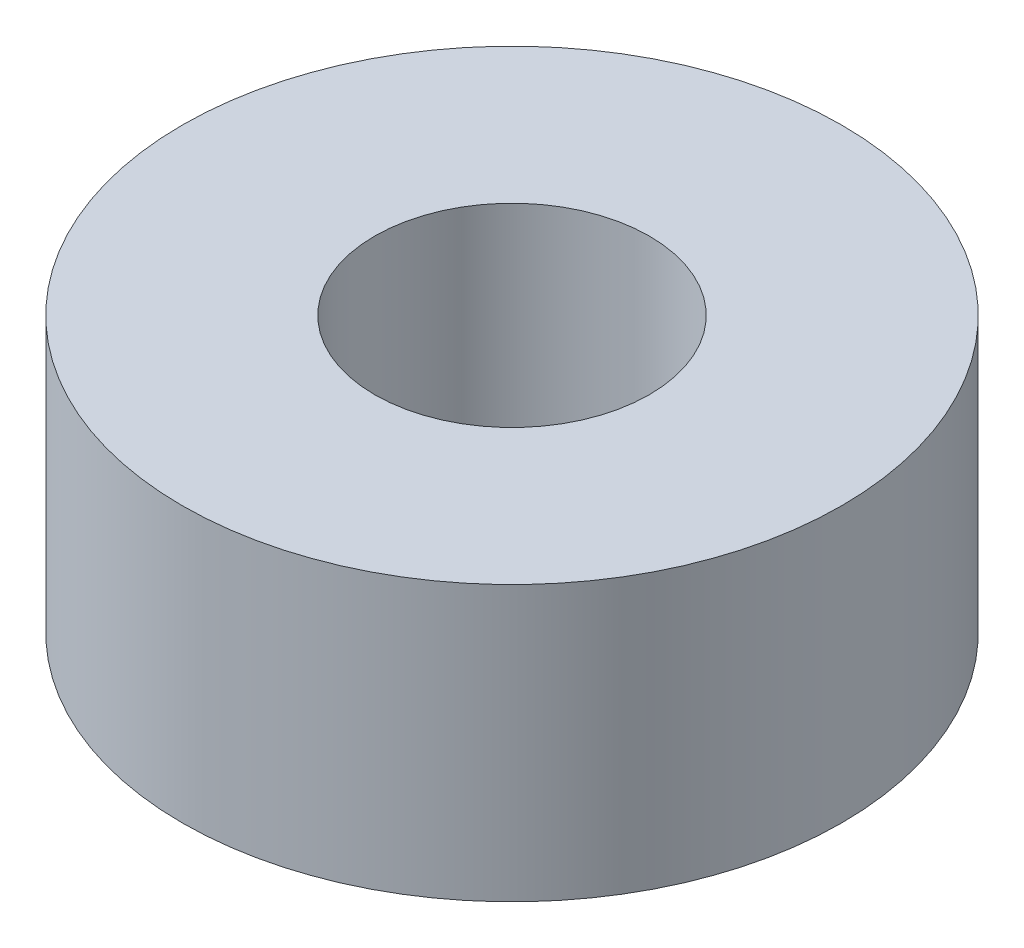
ISO-10303-21;
HEADER;
FILE_DESCRIPTION(('STEP AP214'),'2;1');
FILE_NAME('part.step','',(''),(''),'','','');
FILE_SCHEMA(('AUTOMOTIVE_DESIGN { 1 0 10303 214 1 1 1 1 }'));
ENDSEC;
DATA;
#1=APPLICATION_CONTEXT('core data for automotive mechanical design processes');
#2=APPLICATION_PROTOCOL_DEFINITION('international standard','automotive_design',2000,#1);
#3=PRODUCT_CONTEXT('',#1,'mechanical');
#4=PRODUCT('Part','Part','',(#3));
#5=PRODUCT_RELATED_PRODUCT_CATEGORY('part','',(#4));
#6=PRODUCT_DEFINITION_FORMATION('','',#4);
#7=PRODUCT_DEFINITION_CONTEXT('part definition',#1,'design');
#8=PRODUCT_DEFINITION('design','',#6,#7);
#9=PRODUCT_DEFINITION_SHAPE('','',#8);
#10=(LENGTH_UNIT() NAMED_UNIT(*) SI_UNIT(.MILLI.,.METRE.));
#11=(NAMED_UNIT(*) PLANE_ANGLE_UNIT() SI_UNIT($,.RADIAN.));
#12=(NAMED_UNIT(*) SI_UNIT($,.STERADIAN.) SOLID_ANGLE_UNIT());
#13=UNCERTAINTY_MEASURE_WITH_UNIT(LENGTH_MEASURE(1.E-05),#10,'distance_accuracy_value','');
#14=(GEOMETRIC_REPRESENTATION_CONTEXT(3) GLOBAL_UNCERTAINTY_ASSIGNED_CONTEXT((#13)) GLOBAL_UNIT_ASSIGNED_CONTEXT((#10,
#11,#12)) REPRESENTATION_CONTEXT('',''));
#15=CARTESIAN_POINT('',(0.,0.,0.));
#16=DIRECTION('',(0.,0.,1.));
#17=DIRECTION('',(1.,0.,0.));
#18=AXIS2_PLACEMENT_3D('',#15,#16,#17);
#19=CARTESIAN_POINT('',(0.,5.,0.));
#20=DIRECTION('',(0.,1.,0.));
#21=DIRECTION('',(0.,0.,1.));
#22=AXIS2_PLACEMENT_3D('',#19,#20,#21);
#23=PLANE('',#22);
#24=CARTESIAN_POINT('',(0.,5.,0.));
#25=DIRECTION('',(0.,1.,0.));
#26=DIRECTION('',(0.,0.,1.));
#27=AXIS2_PLACEMENT_3D('',#24,#25,#26);
#28=CIRCLE('',#27,6.);
#29=CARTESIAN_POINT('',(0.,5.,6.));
#30=VERTEX_POINT('',#29);
#31=EDGE_CURVE('E10',#30,#30,#28,.T.);
#32=ORIENTED_EDGE('',*,*,#31,.T.);
#33=EDGE_LOOP('',(#32));
#34=FACE_BOUND('',#33,.T.);
#35=CARTESIAN_POINT('',(0.,5.,0.));
#36=DIRECTION('',(0.,1.,0.));
#37=DIRECTION('',(0.,0.,1.));
#38=AXIS2_PLACEMENT_3D('',#35,#36,#37);
#39=CIRCLE('',#38,2.5);
#40=CARTESIAN_POINT('',(0.,5.,2.5));
#41=VERTEX_POINT('',#40);
#42=EDGE_CURVE('E42',#41,#41,#39,.T.);
#43=ORIENTED_EDGE('',*,*,#42,.F.);
#44=EDGE_LOOP('',(#43));
#45=FACE_BOUND('',#44,.T.);
#46=ADVANCED_FACE('F31',(#34,#45),#23,.T.);
#47=CARTESIAN_POINT('',(0.,0.,0.));
#48=DIRECTION('',(0.,1.,0.));
#49=DIRECTION('',(0.,0.,1.));
#50=AXIS2_PLACEMENT_3D('',#47,#48,#49);
#51=PLANE('',#50);
#52=CARTESIAN_POINT('',(0.,0.,0.));
#53=DIRECTION('',(0.,1.,0.));
#54=DIRECTION('',(0.,0.,1.));
#55=AXIS2_PLACEMENT_3D('',#52,#53,#54);
#56=CIRCLE('',#55,6.);
#57=CARTESIAN_POINT('',(0.,0.,6.));
#58=VERTEX_POINT('',#57);
#59=EDGE_CURVE('E35',#58,#58,#56,.T.);
#60=ORIENTED_EDGE('',*,*,#59,.F.);
#61=EDGE_LOOP('',(#60));
#62=FACE_BOUND('',#61,.T.);
#63=CARTESIAN_POINT('',(0.,0.,0.));
#64=DIRECTION('',(0.,1.,0.));
#65=DIRECTION('',(0.,0.,1.));
#66=AXIS2_PLACEMENT_3D('',#63,#64,#65);
#67=CIRCLE('',#66,2.5);
#68=CARTESIAN_POINT('',(0.,0.,2.5));
#69=VERTEX_POINT('',#68);
#70=EDGE_CURVE('E44',#69,#69,#67,.T.);
#71=ORIENTED_EDGE('',*,*,#70,.T.);
#72=EDGE_LOOP('',(#71));
#73=FACE_BOUND('',#72,.T.);
#74=ADVANCED_FACE('F54',(#62,#73),#51,.F.);
#75=CARTESIAN_POINT('',(0.,5.,0.));
#76=DIRECTION('',(0.,-1.,0.));
#77=DIRECTION('',(0.,0.,-1.));
#78=AXIS2_PLACEMENT_3D('',#75,#76,#77);
#79=CYLINDRICAL_SURFACE('',#78,6.);
#80=ORIENTED_EDGE('',*,*,#31,.F.);
#81=EDGE_LOOP('',(#80));
#82=FACE_BOUND('',#81,.T.);
#83=ORIENTED_EDGE('',*,*,#59,.T.);
#84=EDGE_LOOP('',(#83));
#85=FACE_BOUND('',#84,.T.);
#86=ADVANCED_FACE('F33',(#82,#85),#79,.T.);
#87=CARTESIAN_POINT('',(0.,5.,0.));
#88=DIRECTION('',(0.,-1.,0.));
#89=DIRECTION('',(0.,0.,-1.));
#90=AXIS2_PLACEMENT_3D('',#87,#88,#89);
#91=CYLINDRICAL_SURFACE('',#90,2.5);
#92=ORIENTED_EDGE('',*,*,#42,.T.);
#93=EDGE_LOOP('',(#92));
#94=FACE_BOUND('',#93,.T.);
#95=ORIENTED_EDGE('',*,*,#70,.F.);
#96=EDGE_LOOP('',(#95));
#97=FACE_BOUND('',#96,.T.);
#98=ADVANCED_FACE('F50',(#94,#97),#91,.F.);
#99=CLOSED_SHELL('',(#46,#74,#86,#98));
#100=MANIFOLD_SOLID_BREP('B2',#99);
#101=ADVANCED_BREP_SHAPE_REPRESENTATION('',(#18,#100),#14);
#102=SHAPE_DEFINITION_REPRESENTATION(#9,#101);
ENDSEC;
END-ISO-10303-21;
